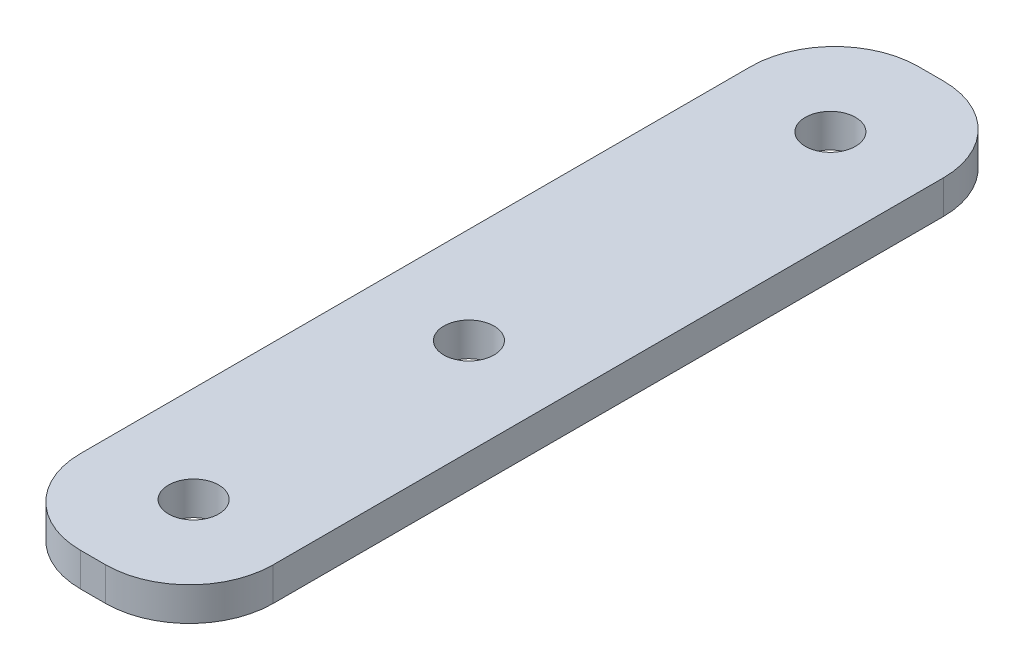
ISO-10303-21;
HEADER;
FILE_DESCRIPTION(('STEP AP214'),'2;1');
FILE_NAME('part.step','',(''),(''),'','','');
FILE_SCHEMA(('AUTOMOTIVE_DESIGN { 1 0 10303 214 1 1 1 1 }'));
ENDSEC;
DATA;
#1=APPLICATION_CONTEXT('core data for automotive mechanical design processes');
#2=APPLICATION_PROTOCOL_DEFINITION('international standard','automotive_design',2000,#1);
#3=PRODUCT_CONTEXT('',#1,'mechanical');
#4=PRODUCT('Part','Part','',(#3));
#5=PRODUCT_RELATED_PRODUCT_CATEGORY('part','',(#4));
#6=PRODUCT_DEFINITION_FORMATION('','',#4);
#7=PRODUCT_DEFINITION_CONTEXT('part definition',#1,'design');
#8=PRODUCT_DEFINITION('design','',#6,#7);
#9=PRODUCT_DEFINITION_SHAPE('','',#8);
#10=(LENGTH_UNIT() NAMED_UNIT(*) SI_UNIT(.MILLI.,.METRE.));
#11=(NAMED_UNIT(*) PLANE_ANGLE_UNIT() SI_UNIT($,.RADIAN.));
#12=(NAMED_UNIT(*) SI_UNIT($,.STERADIAN.) SOLID_ANGLE_UNIT());
#13=UNCERTAINTY_MEASURE_WITH_UNIT(LENGTH_MEASURE(1.E-05),#10,'distance_accuracy_value','');
#14=(GEOMETRIC_REPRESENTATION_CONTEXT(3) GLOBAL_UNCERTAINTY_ASSIGNED_CONTEXT((#13)) GLOBAL_UNIT_ASSIGNED_CONTEXT((#10,
#11,#12)) REPRESENTATION_CONTEXT('',''));
#15=CARTESIAN_POINT('',(0.,0.,0.));
#16=DIRECTION('',(0.,0.,1.));
#17=DIRECTION('',(1.,0.,0.));
#18=AXIS2_PLACEMENT_3D('',#15,#16,#17);
#19=CARTESIAN_POINT('',(0.,0.,50.));
#20=DIRECTION('',(0.,1.,0.));
#21=DIRECTION('',(0.,0.,1.));
#22=AXIS2_PLACEMENT_3D('',#19,#20,#21);
#23=PLANE('',#22);
#24=CARTESIAN_POINT('',(5.75,0.,6.));
#25=DIRECTION('',(0.,1.,0.));
#26=DIRECTION('',(0.,0.,1.));
#27=AXIS2_PLACEMENT_3D('',#24,#25,#26);
#28=CIRCLE('',#27,1.5);
#29=CARTESIAN_POINT('',(5.75,0.,7.5));
#30=VERTEX_POINT('',#29);
#31=EDGE_CURVE('E121',#30,#30,#28,.T.);
#32=ORIENTED_EDGE('',*,*,#31,.T.);
#33=EDGE_LOOP('',(#32));
#34=FACE_BOUND('',#33,.T.);
#35=CARTESIAN_POINT('',(5.75,0.,27.569654610123));
#36=DIRECTION('',(0.,1.,0.));
#37=DIRECTION('',(0.,0.,1.));
#38=AXIS2_PLACEMENT_3D('',#35,#36,#37);
#39=CIRCLE('',#38,1.5);
#40=CARTESIAN_POINT('',(5.75,0.,29.069654610123));
#41=VERTEX_POINT('',#40);
#42=EDGE_CURVE('E171',#41,#41,#39,.T.);
#43=ORIENTED_EDGE('',*,*,#42,.T.);
#44=EDGE_LOOP('',(#43));
#45=FACE_BOUND('',#44,.T.);
#46=CARTESIAN_POINT('',(5.75,0.,44.));
#47=DIRECTION('',(0.,1.,0.));
#48=DIRECTION('',(0.,0.,1.));
#49=AXIS2_PLACEMENT_3D('',#46,#47,#48);
#50=CIRCLE('',#49,1.5);
#51=CARTESIAN_POINT('',(5.75,0.,45.5));
#52=VERTEX_POINT('',#51);
#53=EDGE_CURVE('E174',#52,#52,#50,.T.);
#54=ORIENTED_EDGE('',*,*,#53,.T.);
#55=EDGE_LOOP('',(#54));
#56=FACE_BOUND('',#55,.T.);
#57=DIRECTION('',(1.,0.,0.));
#58=VECTOR('',#57,1.);
#59=CARTESIAN_POINT('',(0.,0.,0.));
#60=LINE('',#59,#58);
#61=CARTESIAN_POINT('',(5.,0.,0.));
#62=VERTEX_POINT('',#61);
#63=CARTESIAN_POINT('',(6.5,0.,0.));
#64=VERTEX_POINT('',#63);
#65=EDGE_CURVE('E102',#62,#64,#60,.T.);
#66=ORIENTED_EDGE('',*,*,#65,.T.);
#67=CARTESIAN_POINT('',(6.5,0.,5.));
#68=DIRECTION('',(0.,1.,0.));
#69=DIRECTION('',(0.,0.,1.));
#70=AXIS2_PLACEMENT_3D('',#67,#68,#69);
#71=CIRCLE('',#70,5.);
#72=CARTESIAN_POINT('',(11.5,0.,5.));
#73=VERTEX_POINT('',#72);
#74=EDGE_CURVE('E135',#64,#73,#71,.F.);
#75=ORIENTED_EDGE('',*,*,#74,.T.);
#76=DIRECTION('',(0.,0.,-1.));
#77=VECTOR('',#76,1.);
#78=CARTESIAN_POINT('',(11.5,0.,50.));
#79=LINE('',#78,#77);
#80=CARTESIAN_POINT('',(11.5,0.,45.));
#81=VERTEX_POINT('',#80);
#82=EDGE_CURVE('E125',#81,#73,#79,.T.);
#83=ORIENTED_EDGE('',*,*,#82,.F.);
#84=CARTESIAN_POINT('',(6.5,0.,45.));
#85=DIRECTION('',(0.,1.,0.));
#86=DIRECTION('',(0.,0.,1.));
#87=AXIS2_PLACEMENT_3D('',#84,#85,#86);
#88=CIRCLE('',#87,5.);
#89=CARTESIAN_POINT('',(6.5,0.,50.));
#90=VERTEX_POINT('',#89);
#91=EDGE_CURVE('E109',#81,#90,#88,.F.);
#92=ORIENTED_EDGE('',*,*,#91,.T.);
#93=DIRECTION('',(1.,0.,0.));
#94=VECTOR('',#93,1.);
#95=CARTESIAN_POINT('',(0.,0.,50.));
#96=LINE('',#95,#94);
#97=CARTESIAN_POINT('',(5.,0.,50.));
#98=VERTEX_POINT('',#97);
#99=EDGE_CURVE('E165',#98,#90,#96,.T.);
#100=ORIENTED_EDGE('',*,*,#99,.F.);
#101=CARTESIAN_POINT('',(5.,0.,45.));
#102=DIRECTION('',(0.,1.,0.));
#103=DIRECTION('',(0.,0.,1.));
#104=AXIS2_PLACEMENT_3D('',#101,#102,#103);
#105=CIRCLE('',#104,5.);
#106=CARTESIAN_POINT('',(0.,0.,45.));
#107=VERTEX_POINT('',#106);
#108=EDGE_CURVE('E108',#98,#107,#105,.F.);
#109=ORIENTED_EDGE('',*,*,#108,.T.);
#110=DIRECTION('',(0.,0.,-1.));
#111=VECTOR('',#110,1.);
#112=CARTESIAN_POINT('',(0.,0.,50.));
#113=LINE('',#112,#111);
#114=CARTESIAN_POINT('',(0.,0.,5.));
#115=VERTEX_POINT('',#114);
#116=EDGE_CURVE('E104',#107,#115,#113,.T.);
#117=ORIENTED_EDGE('',*,*,#116,.T.);
#118=CARTESIAN_POINT('',(5.,0.,5.));
#119=DIRECTION('',(0.,1.,0.));
#120=DIRECTION('',(0.,0.,1.));
#121=AXIS2_PLACEMENT_3D('',#118,#119,#120);
#122=CIRCLE('',#121,5.);
#123=EDGE_CURVE('E100',#115,#62,#122,.F.);
#124=ORIENTED_EDGE('',*,*,#123,.T.);
#125=EDGE_LOOP('',(#66,#75,#83,#92,#100,#109,#117,#124));
#126=FACE_BOUND('',#125,.T.);
#127=ADVANCED_FACE('F35',(#34,#45,#56,#126),#23,.F.);
#128=CARTESIAN_POINT('',(11.5,2.,50.));
#129=DIRECTION('',(1.,0.,0.));
#130=DIRECTION('',(0.,0.,-1.));
#131=AXIS2_PLACEMENT_3D('',#128,#129,#130);
#132=PLANE('',#131);
#133=ORIENTED_EDGE('',*,*,#82,.T.);
#134=DIRECTION('',(0.,-1.,0.));
#135=VECTOR('',#134,1.);
#136=CARTESIAN_POINT('',(11.5,2.,5.));
#137=LINE('',#136,#135);
#138=CARTESIAN_POINT('',(11.5,2.,5.));
#139=VERTEX_POINT('',#138);
#140=EDGE_CURVE('E140',#73,#139,#137,.F.);
#141=ORIENTED_EDGE('',*,*,#140,.T.);
#142=DIRECTION('',(0.,0.,-1.));
#143=VECTOR('',#142,1.);
#144=CARTESIAN_POINT('',(11.5,2.,50.));
#145=LINE('',#144,#143);
#146=CARTESIAN_POINT('',(11.5,2.,45.));
#147=VERTEX_POINT('',#146);
#148=EDGE_CURVE('E129',#147,#139,#145,.T.);
#149=ORIENTED_EDGE('',*,*,#148,.F.);
#150=DIRECTION('',(0.,-1.,0.));
#151=VECTOR('',#150,1.);
#152=CARTESIAN_POINT('',(11.5,0.,45.));
#153=LINE('',#152,#151);
#154=EDGE_CURVE('E137',#147,#81,#153,.T.);
#155=ORIENTED_EDGE('',*,*,#154,.T.);
#156=EDGE_LOOP('',(#133,#141,#149,#155));
#157=FACE_BOUND('',#156,.T.);
#158=ADVANCED_FACE('F192',(#157),#132,.T.);
#159=CARTESIAN_POINT('',(0.,2.,50.));
#160=DIRECTION('',(0.,1.,0.));
#161=DIRECTION('',(0.,0.,1.));
#162=AXIS2_PLACEMENT_3D('',#159,#160,#161);
#163=PLANE('',#162);
#164=CARTESIAN_POINT('',(5.75,2.,6.));
#165=DIRECTION('',(0.,1.,0.));
#166=DIRECTION('',(0.,0.,1.));
#167=AXIS2_PLACEMENT_3D('',#164,#165,#166);
#168=CIRCLE('',#167,1.5);
#169=CARTESIAN_POINT('',(5.75,2.,7.5));
#170=VERTEX_POINT('',#169);
#171=EDGE_CURVE('E177',#170,#170,#168,.T.);
#172=ORIENTED_EDGE('',*,*,#171,.F.);
#173=EDGE_LOOP('',(#172));
#174=FACE_BOUND('',#173,.T.);
#175=CARTESIAN_POINT('',(5.75,2.,27.569654610123));
#176=DIRECTION('',(0.,1.,0.));
#177=DIRECTION('',(0.,0.,1.));
#178=AXIS2_PLACEMENT_3D('',#175,#176,#177);
#179=CIRCLE('',#178,1.5);
#180=CARTESIAN_POINT('',(5.75,2.,29.069654610123));
#181=VERTEX_POINT('',#180);
#182=EDGE_CURVE('E181',#181,#181,#179,.T.);
#183=ORIENTED_EDGE('',*,*,#182,.F.);
#184=EDGE_LOOP('',(#183));
#185=FACE_BOUND('',#184,.T.);
#186=CARTESIAN_POINT('',(5.75,2.,44.));
#187=DIRECTION('',(0.,1.,0.));
#188=DIRECTION('',(0.,0.,1.));
#189=AXIS2_PLACEMENT_3D('',#186,#187,#188);
#190=CIRCLE('',#189,1.5);
#191=CARTESIAN_POINT('',(5.75,2.,45.5));
#192=VERTEX_POINT('',#191);
#193=EDGE_CURVE('E178',#192,#192,#190,.T.);
#194=ORIENTED_EDGE('',*,*,#193,.F.);
#195=EDGE_LOOP('',(#194));
#196=FACE_BOUND('',#195,.T.);
#197=ORIENTED_EDGE('',*,*,#148,.T.);
#198=CARTESIAN_POINT('',(6.5,2.,5.));
#199=DIRECTION('',(0.,1.,0.));
#200=DIRECTION('',(0.,0.,1.));
#201=AXIS2_PLACEMENT_3D('',#198,#199,#200);
#202=CIRCLE('',#201,5.);
#203=CARTESIAN_POINT('',(6.5,2.,0.));
#204=VERTEX_POINT('',#203);
#205=EDGE_CURVE('E146',#139,#204,#202,.T.);
#206=ORIENTED_EDGE('',*,*,#205,.T.);
#207=DIRECTION('',(1.,0.,0.));
#208=VECTOR('',#207,1.);
#209=CARTESIAN_POINT('',(0.,2.,0.));
#210=LINE('',#209,#208);
#211=CARTESIAN_POINT('',(5.,2.,0.));
#212=VERTEX_POINT('',#211);
#213=EDGE_CURVE('E120',#212,#204,#210,.T.);
#214=ORIENTED_EDGE('',*,*,#213,.F.);
#215=CARTESIAN_POINT('',(5.,2.,5.));
#216=DIRECTION('',(0.,1.,0.));
#217=DIRECTION('',(0.,0.,1.));
#218=AXIS2_PLACEMENT_3D('',#215,#216,#217);
#219=CIRCLE('',#218,5.);
#220=CARTESIAN_POINT('',(0.,2.,5.));
#221=VERTEX_POINT('',#220);
#222=EDGE_CURVE('E124',#212,#221,#219,.T.);
#223=ORIENTED_EDGE('',*,*,#222,.T.);
#224=DIRECTION('',(0.,0.,-1.));
#225=VECTOR('',#224,1.);
#226=CARTESIAN_POINT('',(0.,2.,50.));
#227=LINE('',#226,#225);
#228=CARTESIAN_POINT('',(0.,2.,45.));
#229=VERTEX_POINT('',#228);
#230=EDGE_CURVE('E156',#229,#221,#227,.T.);
#231=ORIENTED_EDGE('',*,*,#230,.F.);
#232=CARTESIAN_POINT('',(5.,2.,45.));
#233=DIRECTION('',(0.,1.,0.));
#234=DIRECTION('',(0.,0.,1.));
#235=AXIS2_PLACEMENT_3D('',#232,#233,#234);
#236=CIRCLE('',#235,5.);
#237=CARTESIAN_POINT('',(5.,2.,50.));
#238=VERTEX_POINT('',#237);
#239=EDGE_CURVE('E56',#229,#238,#236,.T.);
#240=ORIENTED_EDGE('',*,*,#239,.T.);
#241=DIRECTION('',(1.,0.,0.));
#242=VECTOR('',#241,1.);
#243=CARTESIAN_POINT('',(0.,2.,50.));
#244=LINE('',#243,#242);
#245=CARTESIAN_POINT('',(6.5,2.,50.));
#246=VERTEX_POINT('',#245);
#247=EDGE_CURVE('E162',#238,#246,#244,.T.);
#248=ORIENTED_EDGE('',*,*,#247,.T.);
#249=CARTESIAN_POINT('',(6.5,2.,45.));
#250=DIRECTION('',(0.,1.,0.));
#251=DIRECTION('',(0.,0.,1.));
#252=AXIS2_PLACEMENT_3D('',#249,#250,#251);
#253=CIRCLE('',#252,5.);
#254=EDGE_CURVE('E142',#246,#147,#253,.T.);
#255=ORIENTED_EDGE('',*,*,#254,.T.);
#256=EDGE_LOOP('',(#197,#206,#214,#223,#231,#240,#248,#255));
#257=FACE_BOUND('',#256,.T.);
#258=ADVANCED_FACE('F160',(#174,#185,#196,#257),#163,.T.);
#259=CARTESIAN_POINT('',(0.,0.,50.));
#260=DIRECTION('',(-1.,0.,0.));
#261=DIRECTION('',(0.,0.,1.));
#262=AXIS2_PLACEMENT_3D('',#259,#260,#261);
#263=PLANE('',#262);
#264=ORIENTED_EDGE('',*,*,#116,.F.);
#265=DIRECTION('',(0.,1.,0.));
#266=VECTOR('',#265,1.);
#267=CARTESIAN_POINT('',(0.,2.,45.));
#268=LINE('',#267,#266);
#269=EDGE_CURVE('E150',#107,#229,#268,.T.);
#270=ORIENTED_EDGE('',*,*,#269,.T.);
#271=ORIENTED_EDGE('',*,*,#230,.T.);
#272=DIRECTION('',(0.,1.,0.));
#273=VECTOR('',#272,1.);
#274=CARTESIAN_POINT('',(0.,0.,5.));
#275=LINE('',#274,#273);
#276=EDGE_CURVE('E148',#221,#115,#275,.F.);
#277=ORIENTED_EDGE('',*,*,#276,.T.);
#278=EDGE_LOOP('',(#264,#270,#271,#277));
#279=FACE_BOUND('',#278,.T.);
#280=ADVANCED_FACE('F155',(#279),#263,.T.);
#281=CARTESIAN_POINT('',(0.,0.,50.));
#282=DIRECTION('',(0.,0.,-1.));
#283=DIRECTION('',(-1.,0.,0.));
#284=AXIS2_PLACEMENT_3D('',#281,#282,#283);
#285=PLANE('',#284);
#286=ORIENTED_EDGE('',*,*,#247,.F.);
#287=DIRECTION('',(0.,1.,0.));
#288=VECTOR('',#287,1.);
#289=CARTESIAN_POINT('',(5.,0.,50.));
#290=LINE('',#289,#288);
#291=EDGE_CURVE('E11',#238,#98,#290,.F.);
#292=ORIENTED_EDGE('',*,*,#291,.T.);
#293=ORIENTED_EDGE('',*,*,#99,.T.);
#294=DIRECTION('',(0.,-1.,0.));
#295=VECTOR('',#294,1.);
#296=CARTESIAN_POINT('',(6.5,2.,50.));
#297=LINE('',#296,#295);
#298=EDGE_CURVE('E43',#90,#246,#297,.F.);
#299=ORIENTED_EDGE('',*,*,#298,.T.);
#300=EDGE_LOOP('',(#286,#292,#293,#299));
#301=FACE_BOUND('',#300,.T.);
#302=ADVANCED_FACE('F235',(#301),#285,.F.);
#303=CARTESIAN_POINT('',(0.,0.,0.));
#304=DIRECTION('',(0.,0.,-1.));
#305=DIRECTION('',(-1.,0.,0.));
#306=AXIS2_PLACEMENT_3D('',#303,#304,#305);
#307=PLANE('',#306);
#308=ORIENTED_EDGE('',*,*,#213,.T.);
#309=DIRECTION('',(0.,-1.,0.));
#310=VECTOR('',#309,1.);
#311=CARTESIAN_POINT('',(6.5,0.,0.));
#312=LINE('',#311,#310);
#313=EDGE_CURVE('E119',#204,#64,#312,.T.);
#314=ORIENTED_EDGE('',*,*,#313,.T.);
#315=ORIENTED_EDGE('',*,*,#65,.F.);
#316=DIRECTION('',(0.,1.,0.));
#317=VECTOR('',#316,1.);
#318=CARTESIAN_POINT('',(5.,0.,0.));
#319=LINE('',#318,#317);
#320=EDGE_CURVE('E116',#62,#212,#319,.T.);
#321=ORIENTED_EDGE('',*,*,#320,.T.);
#322=EDGE_LOOP('',(#308,#314,#315,#321));
#323=FACE_BOUND('',#322,.T.);
#324=ADVANCED_FACE('F115',(#323),#307,.T.);
#325=CARTESIAN_POINT('',(5.75,-1.,44.));
#326=DIRECTION('',(0.,1.,0.));
#327=DIRECTION('',(0.,0.,1.));
#328=AXIS2_PLACEMENT_3D('',#325,#326,#327);
#329=CYLINDRICAL_SURFACE('',#328,1.5);
#330=ORIENTED_EDGE('',*,*,#193,.T.);
#331=EDGE_LOOP('',(#330));
#332=FACE_BOUND('',#331,.T.);
#333=ORIENTED_EDGE('',*,*,#53,.F.);
#334=EDGE_LOOP('',(#333));
#335=FACE_BOUND('',#334,.T.);
#336=ADVANCED_FACE('F198',(#332,#335),#329,.F.);
#337=CARTESIAN_POINT('',(5.75,-1.,27.569654610123));
#338=DIRECTION('',(0.,1.,0.));
#339=DIRECTION('',(0.,0.,1.));
#340=AXIS2_PLACEMENT_3D('',#337,#338,#339);
#341=CYLINDRICAL_SURFACE('',#340,1.5);
#342=ORIENTED_EDGE('',*,*,#182,.T.);
#343=EDGE_LOOP('',(#342));
#344=FACE_BOUND('',#343,.T.);
#345=ORIENTED_EDGE('',*,*,#42,.F.);
#346=EDGE_LOOP('',(#345));
#347=FACE_BOUND('',#346,.T.);
#348=ADVANCED_FACE('F201',(#344,#347),#341,.F.);
#349=CARTESIAN_POINT('',(5.75,-1.,6.));
#350=DIRECTION('',(0.,1.,0.));
#351=DIRECTION('',(0.,0.,1.));
#352=AXIS2_PLACEMENT_3D('',#349,#350,#351);
#353=CYLINDRICAL_SURFACE('',#352,1.5);
#354=ORIENTED_EDGE('',*,*,#171,.T.);
#355=EDGE_LOOP('',(#354));
#356=FACE_BOUND('',#355,.T.);
#357=ORIENTED_EDGE('',*,*,#31,.F.);
#358=EDGE_LOOP('',(#357));
#359=FACE_BOUND('',#358,.T.);
#360=ADVANCED_FACE('F187',(#356,#359),#353,.F.);
#361=CARTESIAN_POINT('',(6.5,0.,5.));
#362=DIRECTION('',(0.,-1.,0.));
#363=DIRECTION('',(0.,0.,-1.));
#364=AXIS2_PLACEMENT_3D('',#361,#362,#363);
#365=CYLINDRICAL_SURFACE('',#364,5.);
#366=ORIENTED_EDGE('',*,*,#205,.F.);
#367=ORIENTED_EDGE('',*,*,#140,.F.);
#368=ORIENTED_EDGE('',*,*,#74,.F.);
#369=ORIENTED_EDGE('',*,*,#313,.F.);
#370=EDGE_LOOP('',(#366,#367,#368,#369));
#371=FACE_BOUND('',#370,.T.);
#372=ADVANCED_FACE('F215',(#371),#365,.T.);
#373=CARTESIAN_POINT('',(5.,0.,45.));
#374=DIRECTION('',(0.,-1.,0.));
#375=DIRECTION('',(0.,0.,-1.));
#376=AXIS2_PLACEMENT_3D('',#373,#374,#375);
#377=CYLINDRICAL_SURFACE('',#376,5.);
#378=ORIENTED_EDGE('',*,*,#108,.F.);
#379=ORIENTED_EDGE('',*,*,#291,.F.);
#380=ORIENTED_EDGE('',*,*,#239,.F.);
#381=ORIENTED_EDGE('',*,*,#269,.F.);
#382=EDGE_LOOP('',(#378,#379,#380,#381));
#383=FACE_BOUND('',#382,.T.);
#384=ADVANCED_FACE('F218',(#383),#377,.T.);
#385=CARTESIAN_POINT('',(5.,0.,5.));
#386=DIRECTION('',(0.,1.,0.));
#387=DIRECTION('',(0.,0.,1.));
#388=AXIS2_PLACEMENT_3D('',#385,#386,#387);
#389=CYLINDRICAL_SURFACE('',#388,5.);
#390=ORIENTED_EDGE('',*,*,#123,.F.);
#391=ORIENTED_EDGE('',*,*,#276,.F.);
#392=ORIENTED_EDGE('',*,*,#222,.F.);
#393=ORIENTED_EDGE('',*,*,#320,.F.);
#394=EDGE_LOOP('',(#390,#391,#392,#393));
#395=FACE_BOUND('',#394,.T.);
#396=ADVANCED_FACE('F123',(#395),#389,.T.);
#397=CARTESIAN_POINT('',(6.5,2.,45.));
#398=DIRECTION('',(0.,1.,0.));
#399=DIRECTION('',(0.,0.,1.));
#400=AXIS2_PLACEMENT_3D('',#397,#398,#399);
#401=CYLINDRICAL_SURFACE('',#400,5.);
#402=ORIENTED_EDGE('',*,*,#254,.F.);
#403=ORIENTED_EDGE('',*,*,#298,.F.);
#404=ORIENTED_EDGE('',*,*,#91,.F.);
#405=ORIENTED_EDGE('',*,*,#154,.F.);
#406=EDGE_LOOP('',(#402,#403,#404,#405));
#407=FACE_BOUND('',#406,.T.);
#408=ADVANCED_FACE('F37',(#407),#401,.T.);
#409=CLOSED_SHELL('',(#127,#158,#258,#280,#302,#324,#336,#348,#360,#372,#384,#396,#408));
#410=MANIFOLD_SOLID_BREP('B2',#409);
#411=ADVANCED_BREP_SHAPE_REPRESENTATION('',(#18,#410),#14);
#412=SHAPE_DEFINITION_REPRESENTATION(#9,#411);
ENDSEC;
END-ISO-10303-21;
